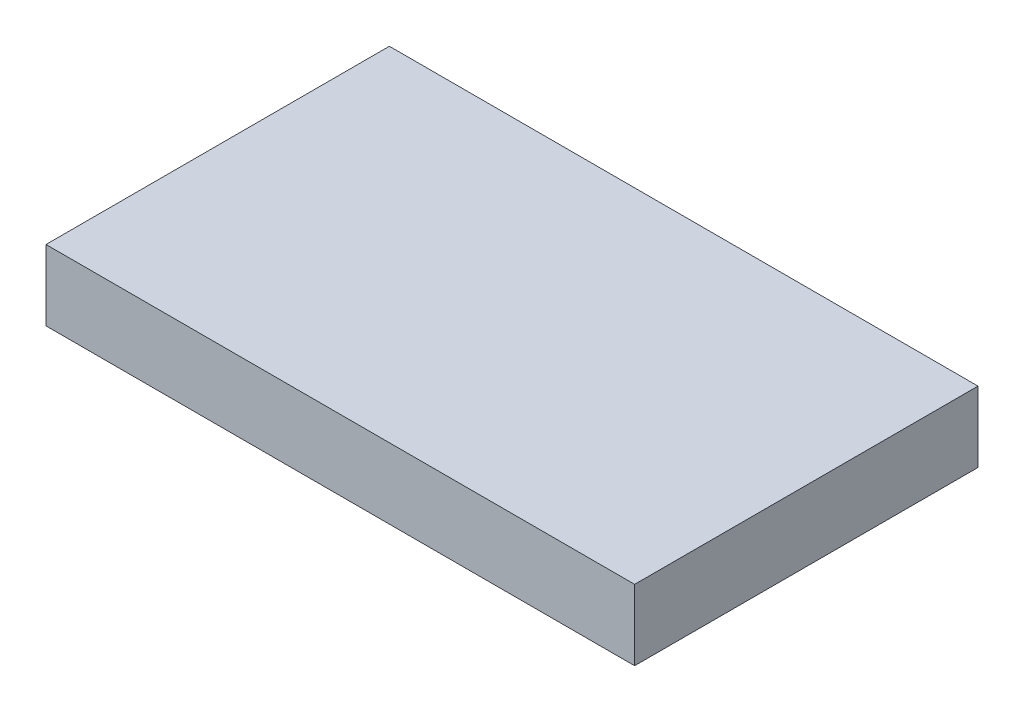
ISO-10303-21;
HEADER;
FILE_DESCRIPTION(('STEP AP214'),'2;1');
FILE_NAME('part.step','',(''),(''),'','','');
FILE_SCHEMA(('AUTOMOTIVE_DESIGN { 1 0 10303 214 1 1 1 1 }'));
ENDSEC;
DATA;
#1=APPLICATION_CONTEXT('core data for automotive mechanical design processes');
#2=APPLICATION_PROTOCOL_DEFINITION('international standard','automotive_design',2000,#1);
#3=PRODUCT_CONTEXT('',#1,'mechanical');
#4=PRODUCT('Part','Part','',(#3));
#5=PRODUCT_RELATED_PRODUCT_CATEGORY('part','',(#4));
#6=PRODUCT_DEFINITION_FORMATION('','',#4);
#7=PRODUCT_DEFINITION_CONTEXT('part definition',#1,'design');
#8=PRODUCT_DEFINITION('design','',#6,#7);
#9=PRODUCT_DEFINITION_SHAPE('','',#8);
#10=(LENGTH_UNIT() NAMED_UNIT(*) SI_UNIT(.MILLI.,.METRE.));
#11=(NAMED_UNIT(*) PLANE_ANGLE_UNIT() SI_UNIT($,.RADIAN.));
#12=(NAMED_UNIT(*) SI_UNIT($,.STERADIAN.) SOLID_ANGLE_UNIT());
#13=UNCERTAINTY_MEASURE_WITH_UNIT(LENGTH_MEASURE(1.E-05),#10,'distance_accuracy_value','');
#14=(GEOMETRIC_REPRESENTATION_CONTEXT(3) GLOBAL_UNCERTAINTY_ASSIGNED_CONTEXT((#13)) GLOBAL_UNIT_ASSIGNED_CONTEXT((#10,
#11,#12)) REPRESENTATION_CONTEXT('',''));
#15=CARTESIAN_POINT('',(0.,0.,0.));
#16=DIRECTION('',(0.,0.,1.));
#17=DIRECTION('',(1.,0.,0.));
#18=AXIS2_PLACEMENT_3D('',#15,#16,#17);
#19=CARTESIAN_POINT('',(-76.2,18.25625,-44.45));
#20=DIRECTION('',(1.,0.,0.));
#21=DIRECTION('',(0.,0.,-1.));
#22=AXIS2_PLACEMENT_3D('',#19,#20,#21);
#23=PLANE('',#22);
#24=DIRECTION('',(0.,0.,1.));
#25=VECTOR('',#24,1.);
#26=CARTESIAN_POINT('',(-76.2,0.,-44.45));
#27=LINE('',#26,#25);
#28=CARTESIAN_POINT('',(-76.2,0.,-44.45));
#29=VERTEX_POINT('',#28);
#30=CARTESIAN_POINT('',(-76.2,0.,44.45));
#31=VERTEX_POINT('',#30);
#32=EDGE_CURVE('E96',#29,#31,#27,.T.);
#33=ORIENTED_EDGE('',*,*,#32,.T.);
#34=DIRECTION('',(0.,-1.,0.));
#35=VECTOR('',#34,1.);
#36=CARTESIAN_POINT('',(-76.2,18.25625,44.45));
#37=LINE('',#36,#35);
#38=CARTESIAN_POINT('',(-76.2,18.25625,44.45));
#39=VERTEX_POINT('',#38);
#40=EDGE_CURVE('E11',#39,#31,#37,.T.);
#41=ORIENTED_EDGE('',*,*,#40,.F.);
#42=DIRECTION('',(0.,0.,1.));
#43=VECTOR('',#42,1.);
#44=CARTESIAN_POINT('',(-76.2,18.25625,-44.45));
#45=LINE('',#44,#43);
#46=CARTESIAN_POINT('',(-76.2,18.25625,-44.45));
#47=VERTEX_POINT('',#46);
#48=EDGE_CURVE('E84',#47,#39,#45,.T.);
#49=ORIENTED_EDGE('',*,*,#48,.F.);
#50=DIRECTION('',(0.,-1.,0.));
#51=VECTOR('',#50,1.);
#52=CARTESIAN_POINT('',(-76.2,18.25625,-44.45));
#53=LINE('',#52,#51);
#54=EDGE_CURVE('E92',#47,#29,#53,.T.);
#55=ORIENTED_EDGE('',*,*,#54,.T.);
#56=EDGE_LOOP('',(#33,#41,#49,#55));
#57=FACE_BOUND('',#56,.T.);
#58=ADVANCED_FACE('F33',(#57),#23,.F.);
#59=CARTESIAN_POINT('',(76.2,18.25625,44.45));
#60=DIRECTION('',(0.,0.,-1.));
#61=DIRECTION('',(-1.,0.,0.));
#62=AXIS2_PLACEMENT_3D('',#59,#60,#61);
#63=PLANE('',#62);
#64=DIRECTION('',(1.,0.,0.));
#65=VECTOR('',#64,1.);
#66=CARTESIAN_POINT('',(76.2,0.,44.45));
#67=LINE('',#66,#65);
#68=CARTESIAN_POINT('',(76.2,0.,44.45));
#69=VERTEX_POINT('',#68);
#70=EDGE_CURVE('E88',#31,#69,#67,.T.);
#71=ORIENTED_EDGE('',*,*,#70,.T.);
#72=DIRECTION('',(0.,-1.,0.));
#73=VECTOR('',#72,1.);
#74=CARTESIAN_POINT('',(76.2,18.25625,44.45));
#75=LINE('',#74,#73);
#76=CARTESIAN_POINT('',(76.2,18.25625,44.45));
#77=VERTEX_POINT('',#76);
#78=EDGE_CURVE('E41',#77,#69,#75,.T.);
#79=ORIENTED_EDGE('',*,*,#78,.F.);
#80=DIRECTION('',(1.,0.,0.));
#81=VECTOR('',#80,1.);
#82=CARTESIAN_POINT('',(76.2,18.25625,44.45));
#83=LINE('',#82,#81);
#84=EDGE_CURVE('E79',#39,#77,#83,.T.);
#85=ORIENTED_EDGE('',*,*,#84,.F.);
#86=ORIENTED_EDGE('',*,*,#40,.T.);
#87=EDGE_LOOP('',(#71,#79,#85,#86));
#88=FACE_BOUND('',#87,.T.);
#89=ADVANCED_FACE('F87',(#88),#63,.F.);
#90=CARTESIAN_POINT('',(76.2,18.25625,-44.45));
#91=DIRECTION('',(-1.,0.,0.));
#92=DIRECTION('',(0.,0.,1.));
#93=AXIS2_PLACEMENT_3D('',#90,#91,#92);
#94=PLANE('',#93);
#95=DIRECTION('',(0.,0.,-1.));
#96=VECTOR('',#95,1.);
#97=CARTESIAN_POINT('',(76.2,0.,-44.45));
#98=LINE('',#97,#96);
#99=CARTESIAN_POINT('',(76.2,0.,-44.45));
#100=VERTEX_POINT('',#99);
#101=EDGE_CURVE('E66',#69,#100,#98,.T.);
#102=ORIENTED_EDGE('',*,*,#101,.T.);
#103=DIRECTION('',(0.,-1.,0.));
#104=VECTOR('',#103,1.);
#105=CARTESIAN_POINT('',(76.2,18.25625,-44.45));
#106=LINE('',#105,#104);
#107=CARTESIAN_POINT('',(76.2,18.25625,-44.45));
#108=VERTEX_POINT('',#107);
#109=EDGE_CURVE('E89',#108,#100,#106,.T.);
#110=ORIENTED_EDGE('',*,*,#109,.F.);
#111=DIRECTION('',(0.,0.,-1.));
#112=VECTOR('',#111,1.);
#113=CARTESIAN_POINT('',(76.2,18.25625,-44.45));
#114=LINE('',#113,#112);
#115=EDGE_CURVE('E82',#77,#108,#114,.T.);
#116=ORIENTED_EDGE('',*,*,#115,.F.);
#117=ORIENTED_EDGE('',*,*,#78,.T.);
#118=EDGE_LOOP('',(#102,#110,#116,#117));
#119=FACE_BOUND('',#118,.T.);
#120=ADVANCED_FACE('F90',(#119),#94,.F.);
#121=CARTESIAN_POINT('',(76.2,18.25625,-44.45));
#122=DIRECTION('',(0.,0.,1.));
#123=DIRECTION('',(1.,0.,0.));
#124=AXIS2_PLACEMENT_3D('',#121,#122,#123);
#125=PLANE('',#124);
#126=DIRECTION('',(-1.,0.,0.));
#127=VECTOR('',#126,1.);
#128=CARTESIAN_POINT('',(76.2,0.,-44.45));
#129=LINE('',#128,#127);
#130=EDGE_CURVE('E72',#100,#29,#129,.T.);
#131=ORIENTED_EDGE('',*,*,#130,.T.);
#132=ORIENTED_EDGE('',*,*,#54,.F.);
#133=DIRECTION('',(-1.,0.,0.));
#134=VECTOR('',#133,1.);
#135=CARTESIAN_POINT('',(76.2,18.25625,-44.45));
#136=LINE('',#135,#134);
#137=EDGE_CURVE('E49',#108,#47,#136,.T.);
#138=ORIENTED_EDGE('',*,*,#137,.F.);
#139=ORIENTED_EDGE('',*,*,#109,.T.);
#140=EDGE_LOOP('',(#131,#132,#138,#139));
#141=FACE_BOUND('',#140,.T.);
#142=ADVANCED_FACE('F103',(#141),#125,.F.);
#143=CARTESIAN_POINT('',(0.,18.25625,0.));
#144=DIRECTION('',(0.,-1.,0.));
#145=DIRECTION('',(0.,0.,-1.));
#146=AXIS2_PLACEMENT_3D('',#143,#144,#145);
#147=PLANE('',#146);
#148=ORIENTED_EDGE('',*,*,#48,.T.);
#149=ORIENTED_EDGE('',*,*,#84,.T.);
#150=ORIENTED_EDGE('',*,*,#115,.T.);
#151=ORIENTED_EDGE('',*,*,#137,.T.);
#152=EDGE_LOOP('',(#148,#149,#150,#151));
#153=FACE_BOUND('',#152,.T.);
#154=ADVANCED_FACE('F80',(#153),#147,.F.);
#155=CARTESIAN_POINT('',(0.,0.,0.));
#156=DIRECTION('',(0.,-1.,0.));
#157=DIRECTION('',(0.,0.,-1.));
#158=AXIS2_PLACEMENT_3D('',#155,#156,#157);
#159=PLANE('',#158);
#160=ORIENTED_EDGE('',*,*,#32,.F.);
#161=ORIENTED_EDGE('',*,*,#130,.F.);
#162=ORIENTED_EDGE('',*,*,#101,.F.);
#163=ORIENTED_EDGE('',*,*,#70,.F.);
#164=EDGE_LOOP('',(#160,#161,#162,#163));
#165=FACE_BOUND('',#164,.T.);
#166=ADVANCED_FACE('F106',(#165),#159,.T.);
#167=CLOSED_SHELL('',(#58,#89,#120,#142,#154,#166));
#168=MANIFOLD_SOLID_BREP('B2',#167);
#169=ADVANCED_BREP_SHAPE_REPRESENTATION('',(#18,#168),#14);
#170=SHAPE_DEFINITION_REPRESENTATION(#9,#169);
ENDSEC;
END-ISO-10303-21;
